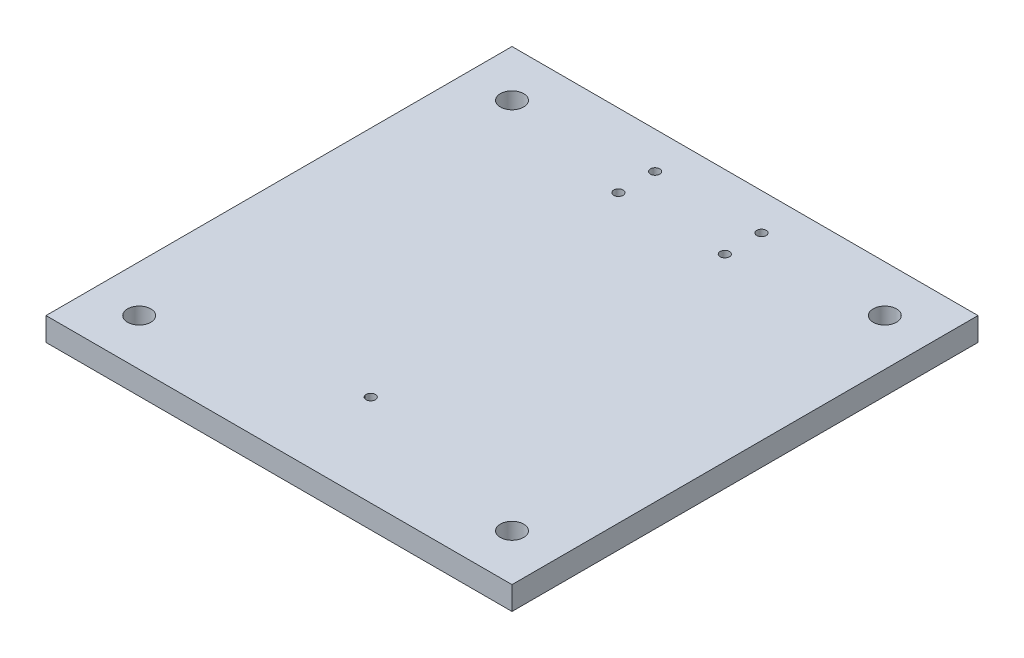
ISO-10303-21;
HEADER;
FILE_DESCRIPTION(('STEP AP214'),'2;1');
FILE_NAME('part.step','',(''),(''),'','','');
FILE_SCHEMA(('AUTOMOTIVE_DESIGN { 1 0 10303 214 1 1 1 1 }'));
ENDSEC;
DATA;
#1=APPLICATION_CONTEXT('core data for automotive mechanical design processes');
#2=APPLICATION_PROTOCOL_DEFINITION('international standard','automotive_design',2000,#1);
#3=PRODUCT_CONTEXT('',#1,'mechanical');
#4=PRODUCT('Part','Part','',(#3));
#5=PRODUCT_RELATED_PRODUCT_CATEGORY('part','',(#4));
#6=PRODUCT_DEFINITION_FORMATION('','',#4);
#7=PRODUCT_DEFINITION_CONTEXT('part definition',#1,'design');
#8=PRODUCT_DEFINITION('design','',#6,#7);
#9=PRODUCT_DEFINITION_SHAPE('','',#8);
#10=(LENGTH_UNIT() NAMED_UNIT(*) SI_UNIT(.MILLI.,.METRE.));
#11=(NAMED_UNIT(*) PLANE_ANGLE_UNIT() SI_UNIT($,.RADIAN.));
#12=(NAMED_UNIT(*) SI_UNIT($,.STERADIAN.) SOLID_ANGLE_UNIT());
#13=UNCERTAINTY_MEASURE_WITH_UNIT(LENGTH_MEASURE(1.E-05),#10,'distance_accuracy_value','');
#14=(GEOMETRIC_REPRESENTATION_CONTEXT(3) GLOBAL_UNCERTAINTY_ASSIGNED_CONTEXT((#13)) GLOBAL_UNIT_ASSIGNED_CONTEXT((#10,
#11,#12)) REPRESENTATION_CONTEXT('',''));
#15=CARTESIAN_POINT('',(0.,0.,0.));
#16=DIRECTION('',(0.,0.,1.));
#17=DIRECTION('',(1.,0.,0.));
#18=AXIS2_PLACEMENT_3D('',#15,#16,#17);
#19=CARTESIAN_POINT('',(0.,6.35,0.));
#20=DIRECTION('',(0.,-1.,0.));
#21=DIRECTION('',(0.,0.,-1.));
#22=AXIS2_PLACEMENT_3D('',#19,#20,#21);
#23=PLANE('',#22);
#24=DIRECTION('',(0.,0.,-1.));
#25=VECTOR('',#24,1.);
#26=CARTESIAN_POINT('',(88.9,6.35,69.85));
#27=LINE('',#26,#25);
#28=CARTESIAN_POINT('',(88.9,6.35,69.85));
#29=VERTEX_POINT('',#28);
#30=CARTESIAN_POINT('',(88.9,6.35,-57.15));
#31=VERTEX_POINT('',#30);
#32=EDGE_CURVE('E84',#29,#31,#27,.T.);
#33=ORIENTED_EDGE('',*,*,#32,.T.);
#34=DIRECTION('',(-1.,0.,0.));
#35=VECTOR('',#34,1.);
#36=CARTESIAN_POINT('',(-38.1,6.35,-57.15));
#37=LINE('',#36,#35);
#38=CARTESIAN_POINT('',(-38.1,6.35,-57.15));
#39=VERTEX_POINT('',#38);
#40=EDGE_CURVE('E79',#31,#39,#37,.T.);
#41=ORIENTED_EDGE('',*,*,#40,.T.);
#42=DIRECTION('',(0.,0.,1.));
#43=VECTOR('',#42,1.);
#44=CARTESIAN_POINT('',(-38.1,6.35,69.85));
#45=LINE('',#44,#43);
#46=CARTESIAN_POINT('',(-38.1,6.35,69.85));
#47=VERTEX_POINT('',#46);
#48=EDGE_CURVE('E82',#39,#47,#45,.T.);
#49=ORIENTED_EDGE('',*,*,#48,.T.);
#50=DIRECTION('',(1.,0.,0.));
#51=VECTOR('',#50,1.);
#52=CARTESIAN_POINT('',(-38.1,6.35,69.85));
#53=LINE('',#52,#51);
#54=EDGE_CURVE('E49',#47,#29,#53,.T.);
#55=ORIENTED_EDGE('',*,*,#54,.T.);
#56=EDGE_LOOP('',(#33,#41,#49,#55));
#57=FACE_BOUND('',#56,.T.);
#58=CARTESIAN_POINT('',(10.9,6.35,-47.15));
#59=DIRECTION('',(0.,1.,0.));
#60=DIRECTION('',(0.,0.,1.));
#61=AXIS2_PLACEMENT_3D('',#58,#59,#60);
#62=CIRCLE('',#61,1.27);
#63=CARTESIAN_POINT('',(10.9,6.35,-45.88));
#64=VERTEX_POINT('',#63);
#65=EDGE_CURVE('E99',#64,#64,#62,.T.);
#66=ORIENTED_EDGE('',*,*,#65,.F.);
#67=EDGE_LOOP('',(#66));
#68=FACE_BOUND('',#67,.T.);
#69=CARTESIAN_POINT('',(39.9,6.35,-47.15));
#70=DIRECTION('',(0.,1.,0.));
#71=DIRECTION('',(0.,0.,1.));
#72=AXIS2_PLACEMENT_3D('',#69,#70,#71);
#73=CIRCLE('',#72,1.27);
#74=CARTESIAN_POINT('',(39.9,6.35,-45.88));
#75=VERTEX_POINT('',#74);
#76=EDGE_CURVE('E114',#75,#75,#73,.T.);
#77=ORIENTED_EDGE('',*,*,#76,.F.);
#78=EDGE_LOOP('',(#77));
#79=FACE_BOUND('',#78,.T.);
#80=CARTESIAN_POINT('',(25.4,6.35,44.85));
#81=DIRECTION('',(0.,1.,0.));
#82=DIRECTION('',(0.,0.,1.));
#83=AXIS2_PLACEMENT_3D('',#80,#81,#82);
#84=CIRCLE('',#83,1.27);
#85=CARTESIAN_POINT('',(25.4,6.35,46.12));
#86=VERTEX_POINT('',#85);
#87=EDGE_CURVE('E120',#86,#86,#84,.T.);
#88=ORIENTED_EDGE('',*,*,#87,.F.);
#89=EDGE_LOOP('',(#88));
#90=FACE_BOUND('',#89,.T.);
#91=CARTESIAN_POINT('',(10.9,6.35,-37.15));
#92=DIRECTION('',(0.,1.,0.));
#93=DIRECTION('',(0.,0.,1.));
#94=AXIS2_PLACEMENT_3D('',#91,#92,#93);
#95=CIRCLE('',#94,1.27);
#96=CARTESIAN_POINT('',(10.9,6.35,-35.88));
#97=VERTEX_POINT('',#96);
#98=EDGE_CURVE('E126',#97,#97,#95,.T.);
#99=ORIENTED_EDGE('',*,*,#98,.F.);
#100=EDGE_LOOP('',(#99));
#101=FACE_BOUND('',#100,.T.);
#102=CARTESIAN_POINT('',(39.9,6.35,-37.15));
#103=DIRECTION('',(0.,1.,0.));
#104=DIRECTION('',(0.,0.,1.));
#105=AXIS2_PLACEMENT_3D('',#102,#103,#104);
#106=CIRCLE('',#105,1.27);
#107=CARTESIAN_POINT('',(39.9,6.35,-35.88));
#108=VERTEX_POINT('',#107);
#109=EDGE_CURVE('E132',#108,#108,#106,.T.);
#110=ORIENTED_EDGE('',*,*,#109,.F.);
#111=EDGE_LOOP('',(#110));
#112=FACE_BOUND('',#111,.T.);
#113=CARTESIAN_POINT('',(-25.4,6.35,-44.45));
#114=DIRECTION('',(0.,1.,0.));
#115=DIRECTION('',(0.,0.,1.));
#116=AXIS2_PLACEMENT_3D('',#113,#114,#115);
#117=CIRCLE('',#116,3.175);
#118=CARTESIAN_POINT('',(-25.4,6.35,-41.275));
#119=VERTEX_POINT('',#118);
#120=EDGE_CURVE('E138',#119,#119,#117,.T.);
#121=ORIENTED_EDGE('',*,*,#120,.F.);
#122=EDGE_LOOP('',(#121));
#123=FACE_BOUND('',#122,.T.);
#124=CARTESIAN_POINT('',(76.2,6.35,-44.45));
#125=DIRECTION('',(0.,1.,0.));
#126=DIRECTION('',(0.,0.,1.));
#127=AXIS2_PLACEMENT_3D('',#124,#125,#126);
#128=CIRCLE('',#127,3.175);
#129=CARTESIAN_POINT('',(76.2,6.35,-41.275));
#130=VERTEX_POINT('',#129);
#131=EDGE_CURVE('E144',#130,#130,#128,.T.);
#132=ORIENTED_EDGE('',*,*,#131,.F.);
#133=EDGE_LOOP('',(#132));
#134=FACE_BOUND('',#133,.T.);
#135=CARTESIAN_POINT('',(76.2000000000011,6.35,57.15));
#136=DIRECTION('',(0.,1.,0.));
#137=DIRECTION('',(0.,0.,1.));
#138=AXIS2_PLACEMENT_3D('',#135,#136,#137);
#139=CIRCLE('',#138,3.175);
#140=CARTESIAN_POINT('',(76.2000000000011,6.35,60.325));
#141=VERTEX_POINT('',#140);
#142=EDGE_CURVE('E150',#141,#141,#139,.T.);
#143=ORIENTED_EDGE('',*,*,#142,.F.);
#144=EDGE_LOOP('',(#143));
#145=FACE_BOUND('',#144,.T.);
#146=CARTESIAN_POINT('',(-25.3999999999989,6.35,57.15));
#147=DIRECTION('',(0.,1.,0.));
#148=DIRECTION('',(0.,0.,1.));
#149=AXIS2_PLACEMENT_3D('',#146,#147,#148);
#150=CIRCLE('',#149,3.175);
#151=CARTESIAN_POINT('',(-25.3999999999989,6.35,60.325));
#152=VERTEX_POINT('',#151);
#153=EDGE_CURVE('E156',#152,#152,#150,.T.);
#154=ORIENTED_EDGE('',*,*,#153,.F.);
#155=EDGE_LOOP('',(#154));
#156=FACE_BOUND('',#155,.T.);
#157=ADVANCED_FACE('F32',(#57,#68,#79,#90,#101,#112,#123,#134,#145,#156),#23,.F.);
#158=CARTESIAN_POINT('',(0.,0.,0.));
#159=DIRECTION('',(0.,-1.,0.));
#160=DIRECTION('',(0.,0.,-1.));
#161=AXIS2_PLACEMENT_3D('',#158,#159,#160);
#162=PLANE('',#161);
#163=CARTESIAN_POINT('',(76.2000000000011,0.,57.15));
#164=DIRECTION('',(0.,1.,0.));
#165=DIRECTION('',(0.,0.,1.));
#166=AXIS2_PLACEMENT_3D('',#163,#164,#165);
#167=CIRCLE('',#166,3.175);
#168=CARTESIAN_POINT('',(76.2000000000011,0.,60.325));
#169=VERTEX_POINT('',#168);
#170=EDGE_CURVE('E153',#169,#169,#167,.T.);
#171=ORIENTED_EDGE('',*,*,#170,.T.);
#172=EDGE_LOOP('',(#171));
#173=FACE_BOUND('',#172,.T.);
#174=CARTESIAN_POINT('',(-25.4,0.,-44.45));
#175=DIRECTION('',(0.,1.,0.));
#176=DIRECTION('',(0.,0.,1.));
#177=AXIS2_PLACEMENT_3D('',#174,#175,#176);
#178=CIRCLE('',#177,3.175);
#179=CARTESIAN_POINT('',(-25.4,0.,-41.275));
#180=VERTEX_POINT('',#179);
#181=EDGE_CURVE('E141',#180,#180,#178,.T.);
#182=ORIENTED_EDGE('',*,*,#181,.T.);
#183=EDGE_LOOP('',(#182));
#184=FACE_BOUND('',#183,.T.);
#185=CARTESIAN_POINT('',(10.9,0.,-37.15));
#186=DIRECTION('',(0.,1.,0.));
#187=DIRECTION('',(0.,0.,1.));
#188=AXIS2_PLACEMENT_3D('',#185,#186,#187);
#189=CIRCLE('',#188,1.27);
#190=CARTESIAN_POINT('',(10.9,0.,-35.88));
#191=VERTEX_POINT('',#190);
#192=EDGE_CURVE('E129',#191,#191,#189,.T.);
#193=ORIENTED_EDGE('',*,*,#192,.T.);
#194=EDGE_LOOP('',(#193));
#195=FACE_BOUND('',#194,.T.);
#196=CARTESIAN_POINT('',(39.9,0.,-47.15));
#197=DIRECTION('',(0.,1.,0.));
#198=DIRECTION('',(0.,0.,1.));
#199=AXIS2_PLACEMENT_3D('',#196,#197,#198);
#200=CIRCLE('',#199,1.27);
#201=CARTESIAN_POINT('',(39.9,0.,-45.88));
#202=VERTEX_POINT('',#201);
#203=EDGE_CURVE('E117',#202,#202,#200,.T.);
#204=ORIENTED_EDGE('',*,*,#203,.T.);
#205=EDGE_LOOP('',(#204));
#206=FACE_BOUND('',#205,.T.);
#207=DIRECTION('',(0.,0.,-1.));
#208=VECTOR('',#207,1.);
#209=CARTESIAN_POINT('',(88.9,0.,69.85));
#210=LINE('',#209,#208);
#211=CARTESIAN_POINT('',(88.9,0.,69.85));
#212=VERTEX_POINT('',#211);
#213=CARTESIAN_POINT('',(88.9,0.,-57.15));
#214=VERTEX_POINT('',#213);
#215=EDGE_CURVE('E96',#212,#214,#210,.T.);
#216=ORIENTED_EDGE('',*,*,#215,.F.);
#217=DIRECTION('',(1.,0.,0.));
#218=VECTOR('',#217,1.);
#219=CARTESIAN_POINT('',(-38.1,0.,69.85));
#220=LINE('',#219,#218);
#221=CARTESIAN_POINT('',(-38.1,0.,69.85));
#222=VERTEX_POINT('',#221);
#223=EDGE_CURVE('E72',#222,#212,#220,.T.);
#224=ORIENTED_EDGE('',*,*,#223,.F.);
#225=DIRECTION('',(0.,0.,1.));
#226=VECTOR('',#225,1.);
#227=CARTESIAN_POINT('',(-38.1,0.,69.85));
#228=LINE('',#227,#226);
#229=CARTESIAN_POINT('',(-38.1,0.,-57.15));
#230=VERTEX_POINT('',#229);
#231=EDGE_CURVE('E66',#230,#222,#228,.T.);
#232=ORIENTED_EDGE('',*,*,#231,.F.);
#233=DIRECTION('',(-1.,0.,0.));
#234=VECTOR('',#233,1.);
#235=CARTESIAN_POINT('',(-38.1,0.,-57.15));
#236=LINE('',#235,#234);
#237=EDGE_CURVE('E88',#214,#230,#236,.T.);
#238=ORIENTED_EDGE('',*,*,#237,.F.);
#239=EDGE_LOOP('',(#216,#224,#232,#238));
#240=FACE_BOUND('',#239,.T.);
#241=CARTESIAN_POINT('',(10.9,0.,-47.15));
#242=DIRECTION('',(0.,1.,0.));
#243=DIRECTION('',(0.,0.,1.));
#244=AXIS2_PLACEMENT_3D('',#241,#242,#243);
#245=CIRCLE('',#244,1.27);
#246=CARTESIAN_POINT('',(10.9,0.,-45.88));
#247=VERTEX_POINT('',#246);
#248=EDGE_CURVE('E111',#247,#247,#245,.T.);
#249=ORIENTED_EDGE('',*,*,#248,.T.);
#250=EDGE_LOOP('',(#249));
#251=FACE_BOUND('',#250,.T.);
#252=CARTESIAN_POINT('',(25.4,0.,44.85));
#253=DIRECTION('',(0.,1.,0.));
#254=DIRECTION('',(0.,0.,1.));
#255=AXIS2_PLACEMENT_3D('',#252,#253,#254);
#256=CIRCLE('',#255,1.27);
#257=CARTESIAN_POINT('',(25.4,0.,46.12));
#258=VERTEX_POINT('',#257);
#259=EDGE_CURVE('E123',#258,#258,#256,.T.);
#260=ORIENTED_EDGE('',*,*,#259,.T.);
#261=EDGE_LOOP('',(#260));
#262=FACE_BOUND('',#261,.T.);
#263=CARTESIAN_POINT('',(39.9,0.,-37.15));
#264=DIRECTION('',(0.,1.,0.));
#265=DIRECTION('',(0.,0.,1.));
#266=AXIS2_PLACEMENT_3D('',#263,#264,#265);
#267=CIRCLE('',#266,1.27);
#268=CARTESIAN_POINT('',(39.9,0.,-35.88));
#269=VERTEX_POINT('',#268);
#270=EDGE_CURVE('E135',#269,#269,#267,.T.);
#271=ORIENTED_EDGE('',*,*,#270,.T.);
#272=EDGE_LOOP('',(#271));
#273=FACE_BOUND('',#272,.T.);
#274=CARTESIAN_POINT('',(76.2,0.,-44.45));
#275=DIRECTION('',(0.,1.,0.));
#276=DIRECTION('',(0.,0.,1.));
#277=AXIS2_PLACEMENT_3D('',#274,#275,#276);
#278=CIRCLE('',#277,3.175);
#279=CARTESIAN_POINT('',(76.2,0.,-41.275));
#280=VERTEX_POINT('',#279);
#281=EDGE_CURVE('E147',#280,#280,#278,.T.);
#282=ORIENTED_EDGE('',*,*,#281,.T.);
#283=EDGE_LOOP('',(#282));
#284=FACE_BOUND('',#283,.T.);
#285=CARTESIAN_POINT('',(-25.3999999999989,0.,57.15));
#286=DIRECTION('',(0.,1.,0.));
#287=DIRECTION('',(0.,0.,1.));
#288=AXIS2_PLACEMENT_3D('',#285,#286,#287);
#289=CIRCLE('',#288,3.175);
#290=CARTESIAN_POINT('',(-25.3999999999989,0.,60.325));
#291=VERTEX_POINT('',#290);
#292=EDGE_CURVE('E159',#291,#291,#289,.T.);
#293=ORIENTED_EDGE('',*,*,#292,.T.);
#294=EDGE_LOOP('',(#293));
#295=FACE_BOUND('',#294,.T.);
#296=ADVANCED_FACE('F107',(#173,#184,#195,#206,#240,#251,#262,#273,#284,#295),#162,.T.);
#297=CARTESIAN_POINT('',(88.9,6.35,69.85));
#298=DIRECTION('',(-1.,0.,0.));
#299=DIRECTION('',(0.,0.,1.));
#300=AXIS2_PLACEMENT_3D('',#297,#298,#299);
#301=PLANE('',#300);
#302=ORIENTED_EDGE('',*,*,#215,.T.);
#303=DIRECTION('',(0.,-1.,0.));
#304=VECTOR('',#303,1.);
#305=CARTESIAN_POINT('',(88.9,6.35,-57.15));
#306=LINE('',#305,#304);
#307=EDGE_CURVE('E11',#31,#214,#306,.T.);
#308=ORIENTED_EDGE('',*,*,#307,.F.);
#309=ORIENTED_EDGE('',*,*,#32,.F.);
#310=DIRECTION('',(0.,-1.,0.));
#311=VECTOR('',#310,1.);
#312=CARTESIAN_POINT('',(88.9,6.35,69.85));
#313=LINE('',#312,#311);
#314=EDGE_CURVE('E92',#29,#212,#313,.T.);
#315=ORIENTED_EDGE('',*,*,#314,.T.);
#316=EDGE_LOOP('',(#302,#308,#309,#315));
#317=FACE_BOUND('',#316,.T.);
#318=ADVANCED_FACE('F34',(#317),#301,.F.);
#319=CARTESIAN_POINT('',(-38.1,6.35,-57.15));
#320=DIRECTION('',(0.,0.,1.));
#321=DIRECTION('',(1.,0.,0.));
#322=AXIS2_PLACEMENT_3D('',#319,#320,#321);
#323=PLANE('',#322);
#324=ORIENTED_EDGE('',*,*,#237,.T.);
#325=DIRECTION('',(0.,-1.,0.));
#326=VECTOR('',#325,1.);
#327=CARTESIAN_POINT('',(-38.1,6.35,-57.15));
#328=LINE('',#327,#326);
#329=EDGE_CURVE('E41',#39,#230,#328,.T.);
#330=ORIENTED_EDGE('',*,*,#329,.F.);
#331=ORIENTED_EDGE('',*,*,#40,.F.);
#332=ORIENTED_EDGE('',*,*,#307,.T.);
#333=EDGE_LOOP('',(#324,#330,#331,#332));
#334=FACE_BOUND('',#333,.T.);
#335=ADVANCED_FACE('F87',(#334),#323,.F.);
#336=CARTESIAN_POINT('',(-38.1,6.35,69.85));
#337=DIRECTION('',(1.,0.,0.));
#338=DIRECTION('',(0.,0.,-1.));
#339=AXIS2_PLACEMENT_3D('',#336,#337,#338);
#340=PLANE('',#339);
#341=ORIENTED_EDGE('',*,*,#231,.T.);
#342=DIRECTION('',(0.,-1.,0.));
#343=VECTOR('',#342,1.);
#344=CARTESIAN_POINT('',(-38.1,6.35,69.85));
#345=LINE('',#344,#343);
#346=EDGE_CURVE('E89',#47,#222,#345,.T.);
#347=ORIENTED_EDGE('',*,*,#346,.F.);
#348=ORIENTED_EDGE('',*,*,#48,.F.);
#349=ORIENTED_EDGE('',*,*,#329,.T.);
#350=EDGE_LOOP('',(#341,#347,#348,#349));
#351=FACE_BOUND('',#350,.T.);
#352=ADVANCED_FACE('F90',(#351),#340,.F.);
#353=CARTESIAN_POINT('',(-38.1,6.35,69.85));
#354=DIRECTION('',(0.,0.,-1.));
#355=DIRECTION('',(-1.,0.,0.));
#356=AXIS2_PLACEMENT_3D('',#353,#354,#355);
#357=PLANE('',#356);
#358=ORIENTED_EDGE('',*,*,#223,.T.);
#359=ORIENTED_EDGE('',*,*,#314,.F.);
#360=ORIENTED_EDGE('',*,*,#54,.F.);
#361=ORIENTED_EDGE('',*,*,#346,.T.);
#362=EDGE_LOOP('',(#358,#359,#360,#361));
#363=FACE_BOUND('',#362,.T.);
#364=ADVANCED_FACE('F104',(#363),#357,.F.);
#365=CARTESIAN_POINT('',(10.9,6.35,-47.15));
#366=DIRECTION('',(0.,-1.,0.));
#367=DIRECTION('',(0.,0.,-1.));
#368=AXIS2_PLACEMENT_3D('',#365,#366,#367);
#369=CYLINDRICAL_SURFACE('',#368,1.27);
#370=ORIENTED_EDGE('',*,*,#65,.T.);
#371=EDGE_LOOP('',(#370));
#372=FACE_BOUND('',#371,.T.);
#373=ORIENTED_EDGE('',*,*,#248,.F.);
#374=EDGE_LOOP('',(#373));
#375=FACE_BOUND('',#374,.T.);
#376=ADVANCED_FACE('F176',(#372,#375),#369,.F.);
#377=CARTESIAN_POINT('',(39.9,6.35,-47.15));
#378=DIRECTION('',(0.,-1.,0.));
#379=DIRECTION('',(0.,0.,-1.));
#380=AXIS2_PLACEMENT_3D('',#377,#378,#379);
#381=CYLINDRICAL_SURFACE('',#380,1.27);
#382=ORIENTED_EDGE('',*,*,#76,.T.);
#383=EDGE_LOOP('',(#382));
#384=FACE_BOUND('',#383,.T.);
#385=ORIENTED_EDGE('',*,*,#203,.F.);
#386=EDGE_LOOP('',(#385));
#387=FACE_BOUND('',#386,.T.);
#388=ADVANCED_FACE('F211',(#384,#387),#381,.F.);
#389=CARTESIAN_POINT('',(25.4,6.35,44.85));
#390=DIRECTION('',(0.,-1.,0.));
#391=DIRECTION('',(0.,0.,-1.));
#392=AXIS2_PLACEMENT_3D('',#389,#390,#391);
#393=CYLINDRICAL_SURFACE('',#392,1.27);
#394=ORIENTED_EDGE('',*,*,#87,.T.);
#395=EDGE_LOOP('',(#394));
#396=FACE_BOUND('',#395,.T.);
#397=ORIENTED_EDGE('',*,*,#259,.F.);
#398=EDGE_LOOP('',(#397));
#399=FACE_BOUND('',#398,.T.);
#400=ADVANCED_FACE('F218',(#396,#399),#393,.F.);
#401=CARTESIAN_POINT('',(10.9,6.35,-37.15));
#402=DIRECTION('',(0.,-1.,0.));
#403=DIRECTION('',(0.,0.,-1.));
#404=AXIS2_PLACEMENT_3D('',#401,#402,#403);
#405=CYLINDRICAL_SURFACE('',#404,1.27);
#406=ORIENTED_EDGE('',*,*,#98,.T.);
#407=EDGE_LOOP('',(#406));
#408=FACE_BOUND('',#407,.T.);
#409=ORIENTED_EDGE('',*,*,#192,.F.);
#410=EDGE_LOOP('',(#409));
#411=FACE_BOUND('',#410,.T.);
#412=ADVANCED_FACE('F225',(#408,#411),#405,.F.);
#413=CARTESIAN_POINT('',(39.9,6.35,-37.15));
#414=DIRECTION('',(0.,-1.,0.));
#415=DIRECTION('',(0.,0.,-1.));
#416=AXIS2_PLACEMENT_3D('',#413,#414,#415);
#417=CYLINDRICAL_SURFACE('',#416,1.27);
#418=ORIENTED_EDGE('',*,*,#109,.T.);
#419=EDGE_LOOP('',(#418));
#420=FACE_BOUND('',#419,.T.);
#421=ORIENTED_EDGE('',*,*,#270,.F.);
#422=EDGE_LOOP('',(#421));
#423=FACE_BOUND('',#422,.T.);
#424=ADVANCED_FACE('F233',(#420,#423),#417,.F.);
#425=CARTESIAN_POINT('',(-25.4,6.35,-44.45));
#426=DIRECTION('',(0.,-1.,0.));
#427=DIRECTION('',(0.,0.,-1.));
#428=AXIS2_PLACEMENT_3D('',#425,#426,#427);
#429=CYLINDRICAL_SURFACE('',#428,3.175);
#430=ORIENTED_EDGE('',*,*,#120,.T.);
#431=EDGE_LOOP('',(#430));
#432=FACE_BOUND('',#431,.T.);
#433=ORIENTED_EDGE('',*,*,#181,.F.);
#434=EDGE_LOOP('',(#433));
#435=FACE_BOUND('',#434,.T.);
#436=ADVANCED_FACE('F241',(#432,#435),#429,.F.);
#437=CARTESIAN_POINT('',(76.2,6.35,-44.45));
#438=DIRECTION('',(0.,-1.,0.));
#439=DIRECTION('',(0.,0.,-1.));
#440=AXIS2_PLACEMENT_3D('',#437,#438,#439);
#441=CYLINDRICAL_SURFACE('',#440,3.175);
#442=ORIENTED_EDGE('',*,*,#131,.T.);
#443=EDGE_LOOP('',(#442));
#444=FACE_BOUND('',#443,.T.);
#445=ORIENTED_EDGE('',*,*,#281,.F.);
#446=EDGE_LOOP('',(#445));
#447=FACE_BOUND('',#446,.T.);
#448=ADVANCED_FACE('F249',(#444,#447),#441,.F.);
#449=CARTESIAN_POINT('',(76.2000000000011,6.35,57.15));
#450=DIRECTION('',(0.,-1.,0.));
#451=DIRECTION('',(0.,0.,-1.));
#452=AXIS2_PLACEMENT_3D('',#449,#450,#451);
#453=CYLINDRICAL_SURFACE('',#452,3.175);
#454=ORIENTED_EDGE('',*,*,#142,.T.);
#455=EDGE_LOOP('',(#454));
#456=FACE_BOUND('',#455,.T.);
#457=ORIENTED_EDGE('',*,*,#170,.F.);
#458=EDGE_LOOP('',(#457));
#459=FACE_BOUND('',#458,.T.);
#460=ADVANCED_FACE('F257',(#456,#459),#453,.F.);
#461=CARTESIAN_POINT('',(-25.3999999999989,6.35,57.15));
#462=DIRECTION('',(0.,-1.,0.));
#463=DIRECTION('',(0.,0.,-1.));
#464=AXIS2_PLACEMENT_3D('',#461,#462,#463);
#465=CYLINDRICAL_SURFACE('',#464,3.175);
#466=ORIENTED_EDGE('',*,*,#153,.T.);
#467=EDGE_LOOP('',(#466));
#468=FACE_BOUND('',#467,.T.);
#469=ORIENTED_EDGE('',*,*,#292,.F.);
#470=EDGE_LOOP('',(#469));
#471=FACE_BOUND('',#470,.T.);
#472=ADVANCED_FACE('F165',(#468,#471),#465,.F.);
#473=CLOSED_SHELL('',(#157,#296,#318,#335,#352,#364,#376,#388,#400,#412,#424,#436,#448,#460,#472));
#474=MANIFOLD_SOLID_BREP('B2',#473);
#475=ADVANCED_BREP_SHAPE_REPRESENTATION('',(#18,#474),#14);
#476=SHAPE_DEFINITION_REPRESENTATION(#9,#475);
ENDSEC;
END-ISO-10303-21;
